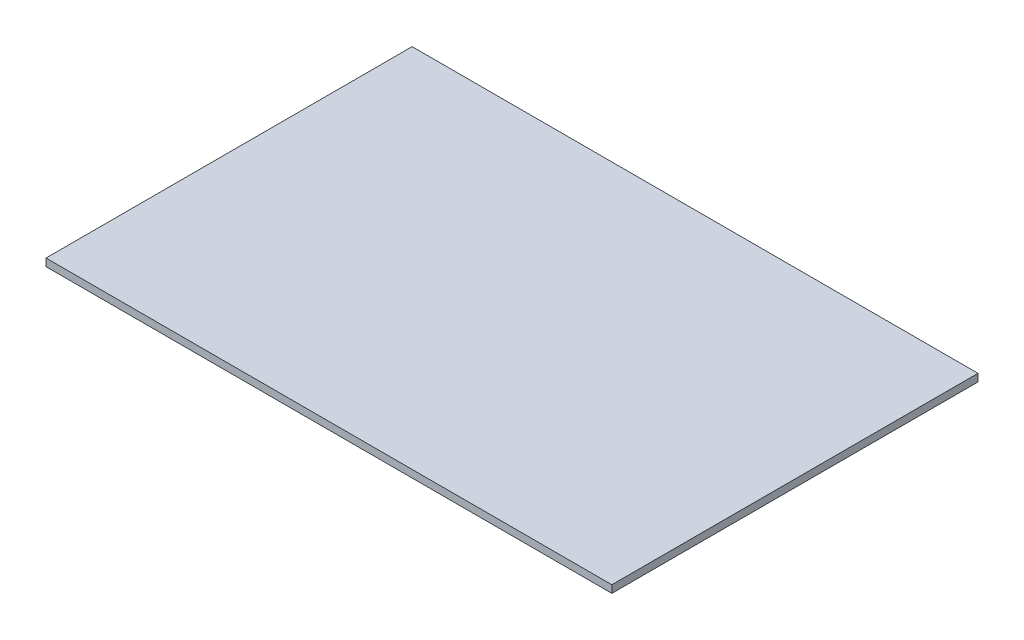
ISO-10303-21;
HEADER;
FILE_DESCRIPTION(('STEP AP214'),'2;1');
FILE_NAME('part.step','',(''),(''),'','','');
FILE_SCHEMA(('AUTOMOTIVE_DESIGN { 1 0 10303 214 1 1 1 1 }'));
ENDSEC;
DATA;
#1=APPLICATION_CONTEXT('core data for automotive mechanical design processes');
#2=APPLICATION_PROTOCOL_DEFINITION('international standard','automotive_design',2000,#1);
#3=PRODUCT_CONTEXT('',#1,'mechanical');
#4=PRODUCT('Part','Part','',(#3));
#5=PRODUCT_RELATED_PRODUCT_CATEGORY('part','',(#4));
#6=PRODUCT_DEFINITION_FORMATION('','',#4);
#7=PRODUCT_DEFINITION_CONTEXT('part definition',#1,'design');
#8=PRODUCT_DEFINITION('design','',#6,#7);
#9=PRODUCT_DEFINITION_SHAPE('','',#8);
#10=(LENGTH_UNIT() NAMED_UNIT(*) SI_UNIT(.MILLI.,.METRE.));
#11=(NAMED_UNIT(*) PLANE_ANGLE_UNIT() SI_UNIT($,.RADIAN.));
#12=(NAMED_UNIT(*) SI_UNIT($,.STERADIAN.) SOLID_ANGLE_UNIT());
#13=UNCERTAINTY_MEASURE_WITH_UNIT(LENGTH_MEASURE(1.E-05),#10,'distance_accuracy_value','');
#14=(GEOMETRIC_REPRESENTATION_CONTEXT(3) GLOBAL_UNCERTAINTY_ASSIGNED_CONTEXT((#13)) GLOBAL_UNIT_ASSIGNED_CONTEXT((#10,
#11,#12)) REPRESENTATION_CONTEXT('',''));
#15=CARTESIAN_POINT('',(0.,0.,0.));
#16=DIRECTION('',(0.,0.,1.));
#17=DIRECTION('',(1.,0.,0.));
#18=AXIS2_PLACEMENT_3D('',#15,#16,#17);
#19=CARTESIAN_POINT('',(-85.,2.25,-55.));
#20=DIRECTION('',(1.,0.,0.));
#21=DIRECTION('',(0.,0.,-1.));
#22=AXIS2_PLACEMENT_3D('',#19,#20,#21);
#23=PLANE('',#22);
#24=DIRECTION('',(0.,0.,1.));
#25=VECTOR('',#24,1.);
#26=CARTESIAN_POINT('',(-85.,0.,-55.));
#27=LINE('',#26,#25);
#28=CARTESIAN_POINT('',(-85.,0.,-55.));
#29=VERTEX_POINT('',#28);
#30=CARTESIAN_POINT('',(-85.,0.,55.));
#31=VERTEX_POINT('',#30);
#32=EDGE_CURVE('E95',#29,#31,#27,.T.);
#33=ORIENTED_EDGE('',*,*,#32,.T.);
#34=DIRECTION('',(0.,-1.,0.));
#35=VECTOR('',#34,1.);
#36=CARTESIAN_POINT('',(-85.,2.25,55.));
#37=LINE('',#36,#35);
#38=CARTESIAN_POINT('',(-85.,2.25,55.));
#39=VERTEX_POINT('',#38);
#40=EDGE_CURVE('E11',#39,#31,#37,.T.);
#41=ORIENTED_EDGE('',*,*,#40,.F.);
#42=DIRECTION('',(0.,0.,1.));
#43=VECTOR('',#42,1.);
#44=CARTESIAN_POINT('',(-85.,2.25,-55.));
#45=LINE('',#44,#43);
#46=CARTESIAN_POINT('',(-85.,2.25,-55.));
#47=VERTEX_POINT('',#46);
#48=EDGE_CURVE('E83',#47,#39,#45,.T.);
#49=ORIENTED_EDGE('',*,*,#48,.F.);
#50=DIRECTION('',(0.,-1.,0.));
#51=VECTOR('',#50,1.);
#52=CARTESIAN_POINT('',(-85.,2.25,-55.));
#53=LINE('',#52,#51);
#54=EDGE_CURVE('E91',#47,#29,#53,.T.);
#55=ORIENTED_EDGE('',*,*,#54,.T.);
#56=EDGE_LOOP('',(#33,#41,#49,#55));
#57=FACE_BOUND('',#56,.T.);
#58=ADVANCED_FACE('F32',(#57),#23,.F.);
#59=CARTESIAN_POINT('',(-85.,2.25,55.));
#60=DIRECTION('',(0.,0.,-1.));
#61=DIRECTION('',(-1.,0.,0.));
#62=AXIS2_PLACEMENT_3D('',#59,#60,#61);
#63=PLANE('',#62);
#64=DIRECTION('',(1.,0.,0.));
#65=VECTOR('',#64,1.);
#66=CARTESIAN_POINT('',(-85.,0.,55.));
#67=LINE('',#66,#65);
#68=CARTESIAN_POINT('',(85.,0.,55.));
#69=VERTEX_POINT('',#68);
#70=EDGE_CURVE('E87',#31,#69,#67,.T.);
#71=ORIENTED_EDGE('',*,*,#70,.T.);
#72=DIRECTION('',(0.,-1.,0.));
#73=VECTOR('',#72,1.);
#74=CARTESIAN_POINT('',(85.,2.25,55.));
#75=LINE('',#74,#73);
#76=CARTESIAN_POINT('',(85.,2.25,55.));
#77=VERTEX_POINT('',#76);
#78=EDGE_CURVE('E40',#77,#69,#75,.T.);
#79=ORIENTED_EDGE('',*,*,#78,.F.);
#80=DIRECTION('',(1.,0.,0.));
#81=VECTOR('',#80,1.);
#82=CARTESIAN_POINT('',(-85.,2.25,55.));
#83=LINE('',#82,#81);
#84=EDGE_CURVE('E78',#39,#77,#83,.T.);
#85=ORIENTED_EDGE('',*,*,#84,.F.);
#86=ORIENTED_EDGE('',*,*,#40,.T.);
#87=EDGE_LOOP('',(#71,#79,#85,#86));
#88=FACE_BOUND('',#87,.T.);
#89=ADVANCED_FACE('F86',(#88),#63,.F.);
#90=CARTESIAN_POINT('',(85.,2.25,-55.));
#91=DIRECTION('',(-1.,0.,0.));
#92=DIRECTION('',(0.,0.,1.));
#93=AXIS2_PLACEMENT_3D('',#90,#91,#92);
#94=PLANE('',#93);
#95=DIRECTION('',(0.,0.,-1.));
#96=VECTOR('',#95,1.);
#97=CARTESIAN_POINT('',(85.,0.,-55.));
#98=LINE('',#97,#96);
#99=CARTESIAN_POINT('',(85.,0.,-55.));
#100=VERTEX_POINT('',#99);
#101=EDGE_CURVE('E65',#69,#100,#98,.T.);
#102=ORIENTED_EDGE('',*,*,#101,.T.);
#103=DIRECTION('',(0.,-1.,0.));
#104=VECTOR('',#103,1.);
#105=CARTESIAN_POINT('',(85.,2.25,-55.));
#106=LINE('',#105,#104);
#107=CARTESIAN_POINT('',(85.,2.25,-55.));
#108=VERTEX_POINT('',#107);
#109=EDGE_CURVE('E88',#108,#100,#106,.T.);
#110=ORIENTED_EDGE('',*,*,#109,.F.);
#111=DIRECTION('',(0.,0.,-1.));
#112=VECTOR('',#111,1.);
#113=CARTESIAN_POINT('',(85.,2.25,-55.));
#114=LINE('',#113,#112);
#115=EDGE_CURVE('E81',#77,#108,#114,.T.);
#116=ORIENTED_EDGE('',*,*,#115,.F.);
#117=ORIENTED_EDGE('',*,*,#78,.T.);
#118=EDGE_LOOP('',(#102,#110,#116,#117));
#119=FACE_BOUND('',#118,.T.);
#120=ADVANCED_FACE('F89',(#119),#94,.F.);
#121=CARTESIAN_POINT('',(-85.,2.25,-55.));
#122=DIRECTION('',(0.,0.,1.));
#123=DIRECTION('',(1.,0.,0.));
#124=AXIS2_PLACEMENT_3D('',#121,#122,#123);
#125=PLANE('',#124);
#126=DIRECTION('',(-1.,0.,0.));
#127=VECTOR('',#126,1.);
#128=CARTESIAN_POINT('',(-85.,0.,-55.));
#129=LINE('',#128,#127);
#130=EDGE_CURVE('E71',#100,#29,#129,.T.);
#131=ORIENTED_EDGE('',*,*,#130,.T.);
#132=ORIENTED_EDGE('',*,*,#54,.F.);
#133=DIRECTION('',(-1.,0.,0.));
#134=VECTOR('',#133,1.);
#135=CARTESIAN_POINT('',(-85.,2.25,-55.));
#136=LINE('',#135,#134);
#137=EDGE_CURVE('E48',#108,#47,#136,.T.);
#138=ORIENTED_EDGE('',*,*,#137,.F.);
#139=ORIENTED_EDGE('',*,*,#109,.T.);
#140=EDGE_LOOP('',(#131,#132,#138,#139));
#141=FACE_BOUND('',#140,.T.);
#142=ADVANCED_FACE('F102',(#141),#125,.F.);
#143=CARTESIAN_POINT('',(0.,2.25,0.));
#144=DIRECTION('',(0.,1.,0.));
#145=DIRECTION('',(0.,0.,1.));
#146=AXIS2_PLACEMENT_3D('',#143,#144,#145);
#147=PLANE('',#146);
#148=ORIENTED_EDGE('',*,*,#48,.T.);
#149=ORIENTED_EDGE('',*,*,#84,.T.);
#150=ORIENTED_EDGE('',*,*,#115,.T.);
#151=ORIENTED_EDGE('',*,*,#137,.T.);
#152=EDGE_LOOP('',(#148,#149,#150,#151));
#153=FACE_BOUND('',#152,.T.);
#154=ADVANCED_FACE('F79',(#153),#147,.T.);
#155=CARTESIAN_POINT('',(0.,0.,0.));
#156=DIRECTION('',(0.,1.,0.));
#157=DIRECTION('',(0.,0.,1.));
#158=AXIS2_PLACEMENT_3D('',#155,#156,#157);
#159=PLANE('',#158);
#160=ORIENTED_EDGE('',*,*,#32,.F.);
#161=ORIENTED_EDGE('',*,*,#130,.F.);
#162=ORIENTED_EDGE('',*,*,#101,.F.);
#163=ORIENTED_EDGE('',*,*,#70,.F.);
#164=EDGE_LOOP('',(#160,#161,#162,#163));
#165=FACE_BOUND('',#164,.T.);
#166=ADVANCED_FACE('F105',(#165),#159,.F.);
#167=CLOSED_SHELL('',(#58,#89,#120,#142,#154,#166));
#168=MANIFOLD_SOLID_BREP('B2',#167);
#169=ADVANCED_BREP_SHAPE_REPRESENTATION('',(#18,#168),#14);
#170=SHAPE_DEFINITION_REPRESENTATION(#9,#169);
ENDSEC;
END-ISO-10303-21;
